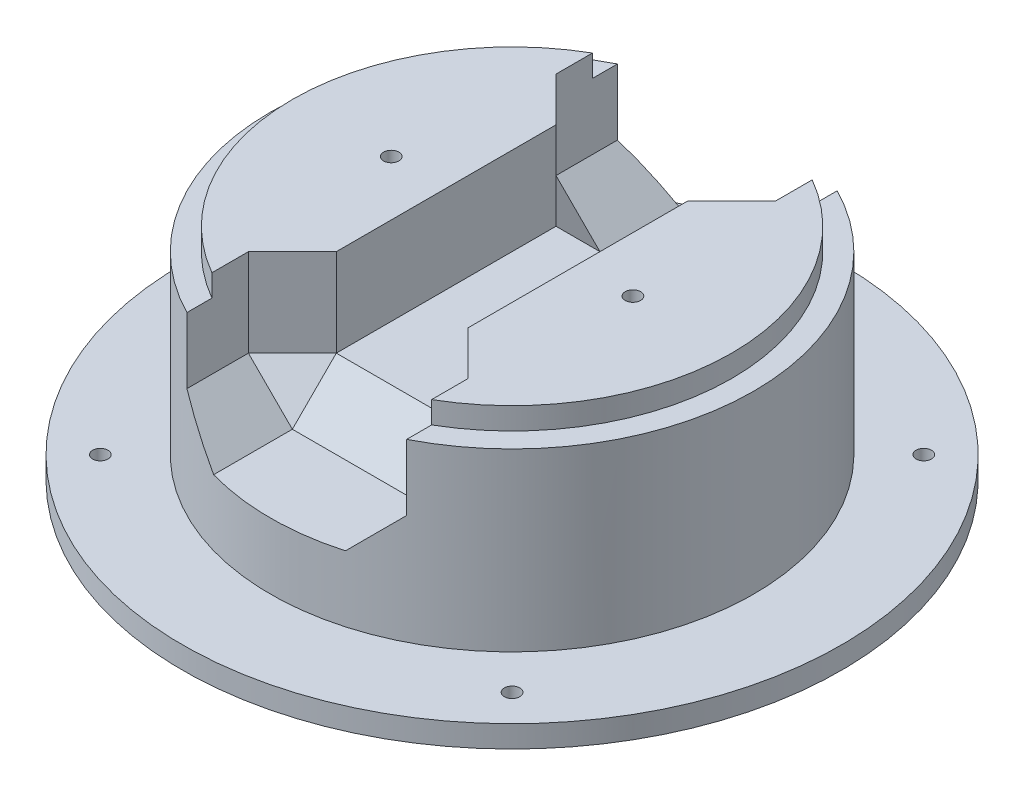
ISO-10303-21;
HEADER;
FILE_DESCRIPTION(('STEP AP214'),'2;1');
FILE_NAME('part.step','',(''),(''),'','','');
FILE_SCHEMA(('AUTOMOTIVE_DESIGN { 1 0 10303 214 1 1 1 1 }'));
ENDSEC;
DATA;
#1=APPLICATION_CONTEXT('core data for automotive mechanical design processes');
#2=APPLICATION_PROTOCOL_DEFINITION('international standard','automotive_design',2000,#1);
#3=PRODUCT_CONTEXT('',#1,'mechanical');
#4=PRODUCT('Part','Part','',(#3));
#5=PRODUCT_RELATED_PRODUCT_CATEGORY('part','',(#4));
#6=PRODUCT_DEFINITION_FORMATION('','',#4);
#7=PRODUCT_DEFINITION_CONTEXT('part definition',#1,'design');
#8=PRODUCT_DEFINITION('design','',#6,#7);
#9=PRODUCT_DEFINITION_SHAPE('','',#8);
#10=(LENGTH_UNIT() NAMED_UNIT(*) SI_UNIT(.MILLI.,.METRE.));
#11=(NAMED_UNIT(*) PLANE_ANGLE_UNIT() SI_UNIT($,.RADIAN.));
#12=(NAMED_UNIT(*) SI_UNIT($,.STERADIAN.) SOLID_ANGLE_UNIT());
#13=UNCERTAINTY_MEASURE_WITH_UNIT(LENGTH_MEASURE(1.E-05),#10,'distance_accuracy_value','');
#14=(GEOMETRIC_REPRESENTATION_CONTEXT(3) GLOBAL_UNCERTAINTY_ASSIGNED_CONTEXT((#13)) GLOBAL_UNIT_ASSIGNED_CONTEXT((#10,
#11,#12)) REPRESENTATION_CONTEXT('',''));
#15=CARTESIAN_POINT('',(0.,0.,0.));
#16=DIRECTION('',(0.,0.,1.));
#17=DIRECTION('',(1.,0.,0.));
#18=AXIS2_PLACEMENT_3D('',#15,#16,#17);
#19=CARTESIAN_POINT('',(0.,45.,0.));
#20=DIRECTION('',(0.,1.,0.));
#21=DIRECTION('',(0.,0.,1.));
#22=AXIS2_PLACEMENT_3D('',#19,#20,#21);
#23=PLANE('',#22);
#24=DIRECTION('',(0.,0.,1.));
#25=VECTOR('',#24,1.);
#26=CARTESIAN_POINT('',(-15.,45.,-25.));
#27=LINE('',#26,#25);
#28=CARTESIAN_POINT('',(-15.,45.,-25.));
#29=VERTEX_POINT('',#28);
#30=CARTESIAN_POINT('',(-15.,45.,25.));
#31=VERTEX_POINT('',#30);
#32=EDGE_CURVE('E229',#29,#31,#27,.T.);
#33=ORIENTED_EDGE('',*,*,#32,.F.);
#34=DIRECTION('',(0.707106781186544,0.,0.707106781186551));
#35=VECTOR('',#34,1.);
#36=CARTESIAN_POINT('',(-15.,45.,-25.));
#37=LINE('',#36,#35);
#38=CARTESIAN_POINT('',(-25.,45.,-35.0000000000001));
#39=VERTEX_POINT('',#38);
#40=EDGE_CURVE('E381',#29,#39,#37,.F.);
#41=ORIENTED_EDGE('',*,*,#40,.T.);
#42=DIRECTION('',(0.,0.,1.));
#43=VECTOR('',#42,1.);
#44=CARTESIAN_POINT('',(-25.,45.,0.));
#45=LINE('',#44,#43);
#46=CARTESIAN_POINT('',(-25.,45.,-43.3012701892219));
#47=VERTEX_POINT('',#46);
#48=EDGE_CURVE('E331',#47,#39,#45,.T.);
#49=ORIENTED_EDGE('',*,*,#48,.F.);
#50=CARTESIAN_POINT('',(0.,45.,0.));
#51=DIRECTION('',(0.,1.,0.));
#52=DIRECTION('',(0.,0.,1.));
#53=AXIS2_PLACEMENT_3D('',#50,#51,#52);
#54=CIRCLE('',#53,50.);
#55=CARTESIAN_POINT('',(-25.,45.,43.3012701892219));
#56=VERTEX_POINT('',#55);
#57=EDGE_CURVE('E311',#47,#56,#54,.T.);
#58=ORIENTED_EDGE('',*,*,#57,.T.);
#59=DIRECTION('',(0.,0.,1.));
#60=VECTOR('',#59,1.);
#61=CARTESIAN_POINT('',(-25.,45.,25.));
#62=LINE('',#61,#60);
#63=CARTESIAN_POINT('',(-25.,45.,35.0000000000001));
#64=VERTEX_POINT('',#63);
#65=EDGE_CURVE('E261',#64,#56,#62,.T.);
#66=ORIENTED_EDGE('',*,*,#65,.F.);
#67=DIRECTION('',(-0.707106781186544,0.,0.707106781186551));
#68=VECTOR('',#67,1.);
#69=CARTESIAN_POINT('',(-25.,45.,35.0000000000001));
#70=LINE('',#69,#68);
#71=EDGE_CURVE('E11',#64,#31,#70,.F.);
#72=ORIENTED_EDGE('',*,*,#71,.T.);
#73=EDGE_LOOP('',(#33,#41,#49,#58,#66,#72));
#74=FACE_BOUND('',#73,.T.);
#75=CARTESIAN_POINT('',(-27.5,45.,0.));
#76=DIRECTION('',(0.,1.,0.));
#77=DIRECTION('',(0.,0.,1.));
#78=AXIS2_PLACEMENT_3D('',#75,#76,#77);
#79=CIRCLE('',#78,1.75);
#80=CARTESIAN_POINT('',(-27.5,45.,1.75));
#81=VERTEX_POINT('',#80);
#82=EDGE_CURVE('E298',#81,#81,#79,.T.);
#83=ORIENTED_EDGE('',*,*,#82,.F.);
#84=EDGE_LOOP('',(#83));
#85=FACE_BOUND('',#84,.T.);
#86=ADVANCED_FACE('F33',(#74,#85),#23,.T.);
#87=CARTESIAN_POINT('',(0.,40.,0.));
#88=DIRECTION('',(0.,1.,0.));
#89=DIRECTION('',(0.,0.,1.));
#90=AXIS2_PLACEMENT_3D('',#87,#88,#89);
#91=PLANE('',#90);
#92=DIRECTION('',(0.,0.,-1.));
#93=VECTOR('',#92,1.);
#94=CARTESIAN_POINT('',(25.,40.,0.));
#95=LINE('',#94,#93);
#96=CARTESIAN_POINT('',(25.,40.,48.9897948556636));
#97=VERTEX_POINT('',#96);
#98=CARTESIAN_POINT('',(25.,40.,43.3012701892219));
#99=VERTEX_POINT('',#98);
#100=EDGE_CURVE('E275',#97,#99,#95,.T.);
#101=ORIENTED_EDGE('',*,*,#100,.F.);
#102=CARTESIAN_POINT('',(0.,40.,0.));
#103=DIRECTION('',(0.,1.,0.));
#104=DIRECTION('',(0.,0.,1.));
#105=AXIS2_PLACEMENT_3D('',#102,#103,#104);
#106=CIRCLE('',#105,55.);
#107=CARTESIAN_POINT('',(25.,40.,-48.9897948556636));
#108=VERTEX_POINT('',#107);
#109=EDGE_CURVE('E327',#97,#108,#106,.T.);
#110=ORIENTED_EDGE('',*,*,#109,.T.);
#111=DIRECTION('',(0.,0.,-1.));
#112=VECTOR('',#111,1.);
#113=CARTESIAN_POINT('',(25.,40.,0.));
#114=LINE('',#113,#112);
#115=CARTESIAN_POINT('',(25.,40.,-43.3012701892219));
#116=VERTEX_POINT('',#115);
#117=EDGE_CURVE('E293',#116,#108,#114,.T.);
#118=ORIENTED_EDGE('',*,*,#117,.F.);
#119=CARTESIAN_POINT('',(0.,40.,0.));
#120=DIRECTION('',(0.,1.,0.));
#121=DIRECTION('',(0.,0.,1.));
#122=AXIS2_PLACEMENT_3D('',#119,#120,#121);
#123=CIRCLE('',#122,50.);
#124=EDGE_CURVE('E310',#99,#116,#123,.T.);
#125=ORIENTED_EDGE('',*,*,#124,.F.);
#126=EDGE_LOOP('',(#101,#110,#118,#125));
#127=FACE_BOUND('',#126,.T.);
#128=ADVANCED_FACE('F429',(#127),#91,.T.);
#129=CARTESIAN_POINT('',(0.,45.,0.));
#130=DIRECTION('',(0.,-1.,0.));
#131=DIRECTION('',(0.,0.,-1.));
#132=AXIS2_PLACEMENT_3D('',#129,#130,#131);
#133=CYLINDRICAL_SURFACE('',#132,50.);
#134=CARTESIAN_POINT('',(25.,45.,43.3012701892219));
#135=VERTEX_POINT('',#134);
#136=CARTESIAN_POINT('',(25.,45.,-43.301270189222));
#137=VERTEX_POINT('',#136);
#138=EDGE_CURVE('E315',#135,#137,#54,.T.);
#139=ORIENTED_EDGE('',*,*,#138,.F.);
#140=DIRECTION('',(0.,-1.,0.));
#141=VECTOR('',#140,1.);
#142=CARTESIAN_POINT('',(25.,45.,43.3012701892219));
#143=LINE('',#142,#141);
#144=EDGE_CURVE('E272',#135,#99,#143,.T.);
#145=ORIENTED_EDGE('',*,*,#144,.T.);
#146=ORIENTED_EDGE('',*,*,#124,.T.);
#147=DIRECTION('',(0.,-1.,0.));
#148=VECTOR('',#147,1.);
#149=CARTESIAN_POINT('',(25.,45.,-43.3012701892219));
#150=LINE('',#149,#148);
#151=EDGE_CURVE('E290',#116,#137,#150,.F.);
#152=ORIENTED_EDGE('',*,*,#151,.T.);
#153=EDGE_LOOP('',(#139,#145,#146,#152));
#154=FACE_BOUND('',#153,.T.);
#155=ADVANCED_FACE('F458',(#154),#133,.T.);
#156=DIRECTION('',(0.,0.,1.));
#157=VECTOR('',#156,1.);
#158=CARTESIAN_POINT('',(-25.,40.,0.));
#159=LINE('',#158,#157);
#160=CARTESIAN_POINT('',(-25.,40.,43.3012701892219));
#161=VERTEX_POINT('',#160);
#162=CARTESIAN_POINT('',(-25.,40.,48.9897948556636));
#163=VERTEX_POINT('',#162);
#164=EDGE_CURVE('E267',#161,#163,#159,.T.);
#165=ORIENTED_EDGE('',*,*,#164,.F.);
#166=CARTESIAN_POINT('',(-25.,40.,-43.3012701892219));
#167=VERTEX_POINT('',#166);
#168=EDGE_CURVE('E316',#167,#161,#123,.T.);
#169=ORIENTED_EDGE('',*,*,#168,.F.);
#170=DIRECTION('',(0.,0.,1.));
#171=VECTOR('',#170,1.);
#172=CARTESIAN_POINT('',(-25.,40.,0.));
#173=LINE('',#172,#171);
#174=CARTESIAN_POINT('',(-25.,40.,-48.9897948556636));
#175=VERTEX_POINT('',#174);
#176=EDGE_CURVE('E285',#175,#167,#173,.T.);
#177=ORIENTED_EDGE('',*,*,#176,.F.);
#178=EDGE_CURVE('E328',#175,#163,#106,.T.);
#179=ORIENTED_EDGE('',*,*,#178,.T.);
#180=EDGE_LOOP('',(#165,#169,#177,#179));
#181=FACE_BOUND('',#180,.T.);
#182=ADVANCED_FACE('F460',(#181),#91,.T.);
#183=CARTESIAN_POINT('',(0.,40.,0.));
#184=DIRECTION('',(0.,-1.,0.));
#185=DIRECTION('',(0.,0.,-1.));
#186=AXIS2_PLACEMENT_3D('',#183,#184,#185);
#187=CYLINDRICAL_SURFACE('',#186,55.);
#188=ORIENTED_EDGE('',*,*,#109,.F.);
#189=DIRECTION('',(0.,-1.,0.));
#190=VECTOR('',#189,1.);
#191=CARTESIAN_POINT('',(25.,40.,48.9897948556636));
#192=LINE('',#191,#190);
#193=CARTESIAN_POINT('',(25.,25.,48.9897948556636));
#194=VERTEX_POINT('',#193);
#195=EDGE_CURVE('E277',#97,#194,#192,.T.);
#196=ORIENTED_EDGE('',*,*,#195,.T.);
#197=CARTESIAN_POINT('',(0.,1.73472347597681E-13,0.));
#198=DIRECTION('',(0.707106781186545,-0.70710678118655,0.));
#199=DIRECTION('',(-0.70710678118655,-0.707106781186545,0.));
#200=AXIS2_PLACEMENT_3D('',#197,#198,#199);
#201=ELLIPSE('',#200,77.7817459305199,55.);
#202=CARTESIAN_POINT('',(14.9999999999999,15.,52.9150262212918));
#203=VERTEX_POINT('',#202);
#204=EDGE_CURVE('E385',#194,#203,#201,.T.);
#205=ORIENTED_EDGE('',*,*,#204,.T.);
#206=CARTESIAN_POINT('',(0.,15.,0.));
#207=DIRECTION('',(0.,1.,0.));
#208=DIRECTION('',(0.,0.,1.));
#209=AXIS2_PLACEMENT_3D('',#206,#207,#208);
#210=CIRCLE('',#209,55.);
#211=CARTESIAN_POINT('',(-14.9999999999999,15.,52.9150262212918));
#212=VERTEX_POINT('',#211);
#213=EDGE_CURVE('E339',#212,#203,#210,.T.);
#214=ORIENTED_EDGE('',*,*,#213,.F.);
#215=CARTESIAN_POINT('',(0.,1.73472347597681E-13,0.));
#216=DIRECTION('',(-0.707106781186545,-0.70710678118655,0.));
#217=DIRECTION('',(0.70710678118655,-0.707106781186545,0.));
#218=AXIS2_PLACEMENT_3D('',#215,#216,#217);
#219=ELLIPSE('',#218,77.7817459305199,55.);
#220=CARTESIAN_POINT('',(-25.,25.,48.9897948556636));
#221=VERTEX_POINT('',#220);
#222=EDGE_CURVE('E383',#212,#221,#219,.T.);
#223=ORIENTED_EDGE('',*,*,#222,.T.);
#224=DIRECTION('',(0.,-1.,0.));
#225=VECTOR('',#224,1.);
#226=CARTESIAN_POINT('',(-25.,40.,48.9897948556636));
#227=LINE('',#226,#225);
#228=EDGE_CURVE('E270',#221,#163,#227,.F.);
#229=ORIENTED_EDGE('',*,*,#228,.T.);
#230=ORIENTED_EDGE('',*,*,#178,.F.);
#231=DIRECTION('',(0.,-1.,0.));
#232=VECTOR('',#231,1.);
#233=CARTESIAN_POINT('',(-25.,40.,-48.9897948556636));
#234=LINE('',#233,#232);
#235=CARTESIAN_POINT('',(-25.,25.,-48.9897948556636));
#236=VERTEX_POINT('',#235);
#237=EDGE_CURVE('E287',#175,#236,#234,.T.);
#238=ORIENTED_EDGE('',*,*,#237,.T.);
#239=CARTESIAN_POINT('',(0.,1.73472347597681E-13,0.));
#240=DIRECTION('',(-0.707106781186545,-0.70710678118655,0.));
#241=DIRECTION('',(0.70710678118655,-0.707106781186545,0.));
#242=AXIS2_PLACEMENT_3D('',#239,#240,#241);
#243=ELLIPSE('',#242,77.7817459305199,55.);
#244=CARTESIAN_POINT('',(-14.9999999999999,15.,-52.9150262212918));
#245=VERTEX_POINT('',#244);
#246=EDGE_CURVE('E205',#236,#245,#243,.T.);
#247=ORIENTED_EDGE('',*,*,#246,.T.);
#248=CARTESIAN_POINT('',(0.,15.,0.));
#249=DIRECTION('',(0.,1.,0.));
#250=DIRECTION('',(0.,0.,1.));
#251=AXIS2_PLACEMENT_3D('',#248,#249,#250);
#252=CIRCLE('',#251,55.);
#253=CARTESIAN_POINT('',(14.9999999999999,15.,-52.9150262212918));
#254=VERTEX_POINT('',#253);
#255=EDGE_CURVE('E334',#254,#245,#252,.T.);
#256=ORIENTED_EDGE('',*,*,#255,.F.);
#257=CARTESIAN_POINT('',(0.,1.73472347597681E-13,0.));
#258=DIRECTION('',(0.707106781186545,-0.70710678118655,0.));
#259=DIRECTION('',(-0.70710678118655,-0.707106781186545,0.));
#260=AXIS2_PLACEMENT_3D('',#257,#258,#259);
#261=ELLIPSE('',#260,77.7817459305199,55.);
#262=CARTESIAN_POINT('',(25.,25.,-48.9897948556636));
#263=VERTEX_POINT('',#262);
#264=EDGE_CURVE('E376',#254,#263,#261,.T.);
#265=ORIENTED_EDGE('',*,*,#264,.T.);
#266=DIRECTION('',(0.,-1.,0.));
#267=VECTOR('',#266,1.);
#268=CARTESIAN_POINT('',(25.,40.,-48.9897948556636));
#269=LINE('',#268,#267);
#270=EDGE_CURVE('E296',#263,#108,#269,.F.);
#271=ORIENTED_EDGE('',*,*,#270,.T.);
#272=EDGE_LOOP('',(#188,#196,#205,#214,#223,#229,#230,#238,#247,#256,#265,#271));
#273=FACE_BOUND('',#272,.T.);
#274=CARTESIAN_POINT('',(0.,0.,0.));
#275=DIRECTION('',(0.,-1.,0.));
#276=DIRECTION('',(0.,0.,-1.));
#277=AXIS2_PLACEMENT_3D('',#274,#275,#276);
#278=CIRCLE('',#277,55.);
#279=CARTESIAN_POINT('',(0.,0.,-55.));
#280=VERTEX_POINT('',#279);
#281=EDGE_CURVE('E322',#280,#280,#278,.T.);
#282=ORIENTED_EDGE('',*,*,#281,.F.);
#283=EDGE_LOOP('',(#282));
#284=FACE_BOUND('',#283,.T.);
#285=ADVANCED_FACE('F418',(#273,#284),#187,.T.);
#286=CARTESIAN_POINT('',(0.,0.,0.));
#287=DIRECTION('',(0.,-1.,0.));
#288=DIRECTION('',(0.,0.,-1.));
#289=AXIS2_PLACEMENT_3D('',#286,#287,#288);
#290=PLANE('',#289);
#291=CARTESIAN_POINT('',(46.8458242536088,0.,46.8458242536088));
#292=DIRECTION('',(0.,1.,0.));
#293=DIRECTION('',(0.,0.,1.));
#294=AXIS2_PLACEMENT_3D('',#291,#292,#293);
#295=CIRCLE('',#294,1.74999999999999);
#296=CARTESIAN_POINT('',(46.8458242536088,0.,48.5958242536088));
#297=VERTEX_POINT('',#296);
#298=EDGE_CURVE('E237',#297,#297,#295,.T.);
#299=ORIENTED_EDGE('',*,*,#298,.F.);
#300=EDGE_LOOP('',(#299));
#301=FACE_BOUND('',#300,.T.);
#302=CARTESIAN_POINT('',(-46.8458242536088,0.,-46.8458242536088));
#303=DIRECTION('',(0.,1.,0.));
#304=DIRECTION('',(0.,0.,1.));
#305=AXIS2_PLACEMENT_3D('',#302,#303,#304);
#306=CIRCLE('',#305,1.74999999999999);
#307=CARTESIAN_POINT('',(-46.8458242536088,0.,-45.0958242536088));
#308=VERTEX_POINT('',#307);
#309=EDGE_CURVE('E236',#308,#308,#306,.T.);
#310=ORIENTED_EDGE('',*,*,#309,.F.);
#311=EDGE_LOOP('',(#310));
#312=FACE_BOUND('',#311,.T.);
#313=CARTESIAN_POINT('',(-46.8458242536088,0.,46.8458242536088));
#314=DIRECTION('',(0.,1.,0.));
#315=DIRECTION('',(0.,0.,1.));
#316=AXIS2_PLACEMENT_3D('',#313,#314,#315);
#317=CIRCLE('',#316,1.74999999999999);
#318=CARTESIAN_POINT('',(-46.8458242536088,0.,48.5958242536088));
#319=VERTEX_POINT('',#318);
#320=EDGE_CURVE('E233',#319,#319,#317,.T.);
#321=ORIENTED_EDGE('',*,*,#320,.F.);
#322=EDGE_LOOP('',(#321));
#323=FACE_BOUND('',#322,.T.);
#324=CARTESIAN_POINT('',(46.8458242536088,0.,-46.8458242536088));
#325=DIRECTION('',(0.,1.,0.));
#326=DIRECTION('',(0.,0.,1.));
#327=AXIS2_PLACEMENT_3D('',#324,#325,#326);
#328=CIRCLE('',#327,1.74999999999999);
#329=CARTESIAN_POINT('',(46.8458242536088,0.,-45.0958242536088));
#330=VERTEX_POINT('',#329);
#331=EDGE_CURVE('E230',#330,#330,#328,.T.);
#332=ORIENTED_EDGE('',*,*,#331,.F.);
#333=EDGE_LOOP('',(#332));
#334=FACE_BOUND('',#333,.T.);
#335=CARTESIAN_POINT('',(0.,0.,0.));
#336=DIRECTION('',(0.,-1.,0.));
#337=DIRECTION('',(0.,0.,-1.));
#338=AXIS2_PLACEMENT_3D('',#335,#336,#337);
#339=CIRCLE('',#338,75.);
#340=CARTESIAN_POINT('',(0.,0.,-75.));
#341=VERTEX_POINT('',#340);
#342=EDGE_CURVE('E314',#341,#341,#339,.T.);
#343=ORIENTED_EDGE('',*,*,#342,.F.);
#344=EDGE_LOOP('',(#343));
#345=FACE_BOUND('',#344,.T.);
#346=ORIENTED_EDGE('',*,*,#281,.T.);
#347=EDGE_LOOP('',(#346));
#348=FACE_BOUND('',#347,.T.);
#349=ADVANCED_FACE('F574',(#301,#312,#323,#334,#345,#348),#290,.F.);
#350=CARTESIAN_POINT('',(0.,-5.,0.));
#351=DIRECTION('',(0.,1.,0.));
#352=DIRECTION('',(0.,0.,1.));
#353=AXIS2_PLACEMENT_3D('',#350,#351,#352);
#354=CYLINDRICAL_SURFACE('',#353,75.);
#355=CARTESIAN_POINT('',(0.,-5.,0.));
#356=DIRECTION('',(0.,-1.,0.));
#357=DIRECTION('',(0.,0.,-1.));
#358=AXIS2_PLACEMENT_3D('',#355,#356,#357);
#359=CIRCLE('',#358,75.);
#360=CARTESIAN_POINT('',(0.,-5.,-75.));
#361=VERTEX_POINT('',#360);
#362=EDGE_CURVE('E319',#361,#361,#359,.T.);
#363=ORIENTED_EDGE('',*,*,#362,.F.);
#364=EDGE_LOOP('',(#363));
#365=FACE_BOUND('',#364,.T.);
#366=ORIENTED_EDGE('',*,*,#342,.T.);
#367=EDGE_LOOP('',(#366));
#368=FACE_BOUND('',#367,.T.);
#369=ADVANCED_FACE('F562',(#365,#368),#354,.T.);
#370=CARTESIAN_POINT('',(0.,-5.,0.));
#371=DIRECTION('',(0.,-1.,0.));
#372=DIRECTION('',(0.,0.,-1.));
#373=AXIS2_PLACEMENT_3D('',#370,#371,#372);
#374=PLANE('',#373);
#375=CARTESIAN_POINT('',(0.,-5.,0.));
#376=DIRECTION('',(0.,-1.,0.));
#377=DIRECTION('',(0.,0.,-1.));
#378=AXIS2_PLACEMENT_3D('',#375,#376,#377);
#379=CIRCLE('',#378,1.74999999999999);
#380=CARTESIAN_POINT('',(0.,-5.,-1.74999999999999));
#381=VERTEX_POINT('',#380);
#382=EDGE_CURVE('E37',#381,#381,#379,.T.);
#383=ORIENTED_EDGE('',*,*,#382,.F.);
#384=EDGE_LOOP('',(#383));
#385=FACE_BOUND('',#384,.T.);
#386=CARTESIAN_POINT('',(46.8458242536088,-5.,46.8458242536088));
#387=DIRECTION('',(0.,-1.,0.));
#388=DIRECTION('',(0.,0.,-1.));
#389=AXIS2_PLACEMENT_3D('',#386,#387,#388);
#390=CIRCLE('',#389,1.74999999999999);
#391=CARTESIAN_POINT('',(46.8458242536088,-5.,45.0958242536088));
#392=VERTEX_POINT('',#391);
#393=EDGE_CURVE('E234',#392,#392,#390,.T.);
#394=ORIENTED_EDGE('',*,*,#393,.F.);
#395=EDGE_LOOP('',(#394));
#396=FACE_BOUND('',#395,.T.);
#397=CARTESIAN_POINT('',(-46.8458242536088,-5.,-46.8458242536088));
#398=DIRECTION('',(0.,-1.,0.));
#399=DIRECTION('',(0.,0.,-1.));
#400=AXIS2_PLACEMENT_3D('',#397,#398,#399);
#401=CIRCLE('',#400,1.74999999999999);
#402=CARTESIAN_POINT('',(-46.8458242536088,-5.,-48.5958242536088));
#403=VERTEX_POINT('',#402);
#404=EDGE_CURVE('E241',#403,#403,#401,.T.);
#405=ORIENTED_EDGE('',*,*,#404,.F.);
#406=EDGE_LOOP('',(#405));
#407=FACE_BOUND('',#406,.T.);
#408=CARTESIAN_POINT('',(-46.8458242536088,-5.,46.8458242536088));
#409=DIRECTION('',(0.,-1.,0.));
#410=DIRECTION('',(0.,0.,-1.));
#411=AXIS2_PLACEMENT_3D('',#408,#409,#410);
#412=CIRCLE('',#411,1.74999999999999);
#413=CARTESIAN_POINT('',(-46.8458242536088,-5.,45.0958242536088));
#414=VERTEX_POINT('',#413);
#415=EDGE_CURVE('E231',#414,#414,#412,.T.);
#416=ORIENTED_EDGE('',*,*,#415,.F.);
#417=EDGE_LOOP('',(#416));
#418=FACE_BOUND('',#417,.T.);
#419=CARTESIAN_POINT('',(46.8458242536088,-5.,-46.8458242536088));
#420=DIRECTION('',(0.,-1.,0.));
#421=DIRECTION('',(0.,0.,-1.));
#422=AXIS2_PLACEMENT_3D('',#419,#420,#421);
#423=CIRCLE('',#422,1.74999999999999);
#424=CARTESIAN_POINT('',(46.8458242536088,-5.,-48.5958242536088));
#425=VERTEX_POINT('',#424);
#426=EDGE_CURVE('E226',#425,#425,#423,.T.);
#427=ORIENTED_EDGE('',*,*,#426,.F.);
#428=EDGE_LOOP('',(#427));
#429=FACE_BOUND('',#428,.T.);
#430=ORIENTED_EDGE('',*,*,#362,.T.);
#431=EDGE_LOOP('',(#430));
#432=FACE_BOUND('',#431,.T.);
#433=ADVANCED_FACE('F472',(#385,#396,#407,#418,#429,#432),#374,.T.);
#434=ORIENTED_EDGE('',*,*,#168,.T.);
#435=DIRECTION('',(0.,-1.,0.));
#436=VECTOR('',#435,1.);
#437=CARTESIAN_POINT('',(-25.,45.,43.3012701892219));
#438=LINE('',#437,#436);
#439=EDGE_CURVE('E263',#161,#56,#438,.F.);
#440=ORIENTED_EDGE('',*,*,#439,.T.);
#441=ORIENTED_EDGE('',*,*,#57,.F.);
#442=DIRECTION('',(0.,-1.,0.));
#443=VECTOR('',#442,1.);
#444=CARTESIAN_POINT('',(-25.,45.,-43.3012701892219));
#445=LINE('',#444,#443);
#446=EDGE_CURVE('E282',#47,#167,#445,.T.);
#447=ORIENTED_EDGE('',*,*,#446,.T.);
#448=EDGE_LOOP('',(#434,#440,#441,#447));
#449=FACE_BOUND('',#448,.T.);
#450=ADVANCED_FACE('F462',(#449),#133,.T.);
#451=DIRECTION('',(0.,0.,-1.));
#452=VECTOR('',#451,1.);
#453=CARTESIAN_POINT('',(15.,45.,-25.));
#454=LINE('',#453,#452);
#455=CARTESIAN_POINT('',(15.,45.,25.));
#456=VERTEX_POINT('',#455);
#457=CARTESIAN_POINT('',(15.,45.,-25.));
#458=VERTEX_POINT('',#457);
#459=EDGE_CURVE('E257',#456,#458,#454,.T.);
#460=ORIENTED_EDGE('',*,*,#459,.F.);
#461=DIRECTION('',(-0.707106781186544,0.,-0.707106781186551));
#462=VECTOR('',#461,1.);
#463=CARTESIAN_POINT('',(15.,45.,25.));
#464=LINE('',#463,#462);
#465=CARTESIAN_POINT('',(25.,45.,35.0000000000001));
#466=VERTEX_POINT('',#465);
#467=EDGE_CURVE('E42',#456,#466,#464,.F.);
#468=ORIENTED_EDGE('',*,*,#467,.T.);
#469=DIRECTION('',(0.,0.,-1.));
#470=VECTOR('',#469,1.);
#471=CARTESIAN_POINT('',(25.,45.,0.));
#472=LINE('',#471,#470);
#473=EDGE_CURVE('E337',#135,#466,#472,.T.);
#474=ORIENTED_EDGE('',*,*,#473,.F.);
#475=ORIENTED_EDGE('',*,*,#138,.T.);
#476=DIRECTION('',(0.,0.,-1.));
#477=VECTOR('',#476,1.);
#478=CARTESIAN_POINT('',(25.,45.,-85.));
#479=LINE('',#478,#477);
#480=CARTESIAN_POINT('',(25.,45.,-35.0000000000001));
#481=VERTEX_POINT('',#480);
#482=EDGE_CURVE('E280',#481,#137,#479,.T.);
#483=ORIENTED_EDGE('',*,*,#482,.F.);
#484=DIRECTION('',(0.707106781186544,0.,-0.707106781186551));
#485=VECTOR('',#484,1.);
#486=CARTESIAN_POINT('',(25.,45.,-35.0000000000001));
#487=LINE('',#486,#485);
#488=EDGE_CURVE('E378',#481,#458,#487,.F.);
#489=ORIENTED_EDGE('',*,*,#488,.T.);
#490=EDGE_LOOP('',(#460,#468,#474,#475,#483,#489));
#491=FACE_BOUND('',#490,.T.);
#492=CARTESIAN_POINT('',(27.5,45.,0.));
#493=DIRECTION('',(0.,1.,0.));
#494=DIRECTION('',(0.,0.,1.));
#495=AXIS2_PLACEMENT_3D('',#492,#493,#494);
#496=CIRCLE('',#495,1.75);
#497=CARTESIAN_POINT('',(27.5,45.,1.74999999999999));
#498=VERTEX_POINT('',#497);
#499=EDGE_CURVE('E304',#498,#498,#496,.T.);
#500=ORIENTED_EDGE('',*,*,#499,.F.);
#501=EDGE_LOOP('',(#500));
#502=FACE_BOUND('',#501,.T.);
#503=ADVANCED_FACE('F453',(#491,#502),#23,.T.);
#504=CARTESIAN_POINT('',(27.5,35.,0.));
#505=DIRECTION('',(0.,1.,0.));
#506=DIRECTION('',(0.,0.,1.));
#507=AXIS2_PLACEMENT_3D('',#504,#505,#506);
#508=CONICAL_SURFACE('',#507,1.75,1.02974425867665);
#509=CARTESIAN_POINT('',(27.5,33.9484939167018,0.));
#510=VERTEX_POINT('',#509);
#511=VERTEX_LOOP('',#510);
#512=FACE_BOUND('',#511,.T.);
#513=CARTESIAN_POINT('',(27.5,35.,0.));
#514=DIRECTION('',(0.,1.,0.));
#515=DIRECTION('',(0.,0.,1.));
#516=AXIS2_PLACEMENT_3D('',#513,#514,#515);
#517=CIRCLE('',#516,1.75);
#518=CARTESIAN_POINT('',(27.5,35.,1.74999999999999));
#519=VERTEX_POINT('',#518);
#520=EDGE_CURVE('E307',#519,#519,#517,.T.);
#521=ORIENTED_EDGE('',*,*,#520,.T.);
#522=EDGE_LOOP('',(#521));
#523=FACE_BOUND('',#522,.T.);
#524=ADVANCED_FACE('F483',(#512,#523),#508,.F.);
#525=CARTESIAN_POINT('',(27.5,45.,0.));
#526=DIRECTION('',(0.,1.,0.));
#527=DIRECTION('',(0.,0.,1.));
#528=AXIS2_PLACEMENT_3D('',#525,#526,#527);
#529=CYLINDRICAL_SURFACE('',#528,1.75);
#530=ORIENTED_EDGE('',*,*,#520,.F.);
#531=EDGE_LOOP('',(#530));
#532=FACE_BOUND('',#531,.T.);
#533=ORIENTED_EDGE('',*,*,#499,.T.);
#534=EDGE_LOOP('',(#533));
#535=FACE_BOUND('',#534,.T.);
#536=ADVANCED_FACE('F488',(#532,#535),#529,.F.);
#537=CARTESIAN_POINT('',(-27.5,35.,0.));
#538=DIRECTION('',(0.,1.,0.));
#539=DIRECTION('',(0.,0.,1.));
#540=AXIS2_PLACEMENT_3D('',#537,#538,#539);
#541=CONICAL_SURFACE('',#540,1.75,1.02974425867665);
#542=CARTESIAN_POINT('',(-27.5,33.9484939167018,0.));
#543=VERTEX_POINT('',#542);
#544=VERTEX_LOOP('',#543);
#545=FACE_BOUND('',#544,.T.);
#546=CARTESIAN_POINT('',(-27.5,35.,0.));
#547=DIRECTION('',(0.,1.,0.));
#548=DIRECTION('',(0.,0.,1.));
#549=AXIS2_PLACEMENT_3D('',#546,#547,#548);
#550=CIRCLE('',#549,1.75);
#551=CARTESIAN_POINT('',(-27.5,35.,1.75));
#552=VERTEX_POINT('',#551);
#553=EDGE_CURVE('E301',#552,#552,#550,.T.);
#554=ORIENTED_EDGE('',*,*,#553,.T.);
#555=EDGE_LOOP('',(#554));
#556=FACE_BOUND('',#555,.T.);
#557=ADVANCED_FACE('F493',(#545,#556),#541,.F.);
#558=CARTESIAN_POINT('',(-27.5,45.,0.));
#559=DIRECTION('',(0.,1.,0.));
#560=DIRECTION('',(0.,0.,1.));
#561=AXIS2_PLACEMENT_3D('',#558,#559,#560);
#562=CYLINDRICAL_SURFACE('',#561,1.75);
#563=ORIENTED_EDGE('',*,*,#553,.F.);
#564=EDGE_LOOP('',(#563));
#565=FACE_BOUND('',#564,.T.);
#566=ORIENTED_EDGE('',*,*,#82,.T.);
#567=EDGE_LOOP('',(#566));
#568=FACE_BOUND('',#567,.T.);
#569=ADVANCED_FACE('F500',(#565,#568),#562,.F.);
#570=CARTESIAN_POINT('',(0.,15.,0.));
#571=DIRECTION('',(0.,1.,0.));
#572=DIRECTION('',(0.,0.,1.));
#573=AXIS2_PLACEMENT_3D('',#570,#571,#572);
#574=PLANE('',#573);
#575=ORIENTED_EDGE('',*,*,#255,.T.);
#576=DIRECTION('',(0.,0.,1.));
#577=VECTOR('',#576,1.);
#578=CARTESIAN_POINT('',(-14.9999999999999,15.,0.));
#579=LINE('',#578,#577);
#580=CARTESIAN_POINT('',(-14.9999999999999,15.,-35.0000000000001));
#581=VERTEX_POINT('',#580);
#582=EDGE_CURVE('E346',#245,#581,#579,.T.);
#583=ORIENTED_EDGE('',*,*,#582,.T.);
#584=DIRECTION('',(1.,0.,0.));
#585=VECTOR('',#584,1.);
#586=CARTESIAN_POINT('',(0.,15.,-35.0000000000001));
#587=LINE('',#586,#585);
#588=CARTESIAN_POINT('',(14.9999999999999,15.,-35.0000000000001));
#589=VERTEX_POINT('',#588);
#590=EDGE_CURVE('E342',#581,#589,#587,.T.);
#591=ORIENTED_EDGE('',*,*,#590,.T.);
#592=DIRECTION('',(0.,0.,-1.));
#593=VECTOR('',#592,1.);
#594=CARTESIAN_POINT('',(14.9999999999999,15.,0.));
#595=LINE('',#594,#593);
#596=EDGE_CURVE('E344',#589,#254,#595,.T.);
#597=ORIENTED_EDGE('',*,*,#596,.T.);
#598=EDGE_LOOP('',(#575,#583,#591,#597));
#599=FACE_BOUND('',#598,.T.);
#600=ADVANCED_FACE('F504',(#599),#574,.T.);
#601=CARTESIAN_POINT('',(25.,15.,-85.));
#602=DIRECTION('',(1.,0.,0.));
#603=DIRECTION('',(0.,0.,-1.));
#604=AXIS2_PLACEMENT_3D('',#601,#602,#603);
#605=PLANE('',#604);
#606=ORIENTED_EDGE('',*,*,#270,.F.);
#607=DIRECTION('',(0.,0.,1.));
#608=VECTOR('',#607,1.);
#609=CARTESIAN_POINT('',(25.,25.,-85.));
#610=LINE('',#609,#608);
#611=CARTESIAN_POINT('',(25.,25.,-35.0000000000001));
#612=VERTEX_POINT('',#611);
#613=EDGE_CURVE('E355',#263,#612,#610,.T.);
#614=ORIENTED_EDGE('',*,*,#613,.T.);
#615=DIRECTION('',(0.,1.,0.));
#616=VECTOR('',#615,1.);
#617=CARTESIAN_POINT('',(25.,45.,-35.0000000000001));
#618=LINE('',#617,#616);
#619=EDGE_CURVE('E353',#612,#481,#618,.T.);
#620=ORIENTED_EDGE('',*,*,#619,.T.);
#621=ORIENTED_EDGE('',*,*,#482,.T.);
#622=ORIENTED_EDGE('',*,*,#151,.F.);
#623=ORIENTED_EDGE('',*,*,#117,.T.);
#624=EDGE_LOOP('',(#606,#614,#620,#621,#622,#623));
#625=FACE_BOUND('',#624,.T.);
#626=ADVANCED_FACE('F436',(#625),#605,.F.);
#627=CARTESIAN_POINT('',(-25.,15.,-85.));
#628=DIRECTION('',(-1.,0.,0.));
#629=DIRECTION('',(0.,0.,1.));
#630=AXIS2_PLACEMENT_3D('',#627,#628,#629);
#631=PLANE('',#630);
#632=DIRECTION('',(0.,-1.,0.));
#633=VECTOR('',#632,1.);
#634=CARTESIAN_POINT('',(-25.,15.,-35.0000000000001));
#635=LINE('',#634,#633);
#636=CARTESIAN_POINT('',(-25.,25.,-35.0000000000001));
#637=VERTEX_POINT('',#636);
#638=EDGE_CURVE('E349',#39,#637,#635,.T.);
#639=ORIENTED_EDGE('',*,*,#638,.T.);
#640=DIRECTION('',(0.,0.,-1.));
#641=VECTOR('',#640,1.);
#642=CARTESIAN_POINT('',(-25.,25.,-85.));
#643=LINE('',#642,#641);
#644=EDGE_CURVE('E351',#637,#236,#643,.T.);
#645=ORIENTED_EDGE('',*,*,#644,.T.);
#646=ORIENTED_EDGE('',*,*,#237,.F.);
#647=ORIENTED_EDGE('',*,*,#176,.T.);
#648=ORIENTED_EDGE('',*,*,#446,.F.);
#649=ORIENTED_EDGE('',*,*,#48,.T.);
#650=EDGE_LOOP('',(#639,#645,#646,#647,#648,#649));
#651=FACE_BOUND('',#650,.T.);
#652=ADVANCED_FACE('F508',(#651),#631,.F.);
#653=CARTESIAN_POINT('',(0.,15.,0.));
#654=DIRECTION('',(0.,1.,0.));
#655=DIRECTION('',(0.,0.,1.));
#656=AXIS2_PLACEMENT_3D('',#653,#654,#655);
#657=PLANE('',#656);
#658=DIRECTION('',(-1.,0.,0.));
#659=VECTOR('',#658,1.);
#660=CARTESIAN_POINT('',(0.,15.,35.0000000000001));
#661=LINE('',#660,#659);
#662=CARTESIAN_POINT('',(14.9999999999999,15.,35.0000000000001));
#663=VERTEX_POINT('',#662);
#664=CARTESIAN_POINT('',(-14.9999999999999,15.,35.0000000000001));
#665=VERTEX_POINT('',#664);
#666=EDGE_CURVE('E217',#663,#665,#661,.T.);
#667=ORIENTED_EDGE('',*,*,#666,.T.);
#668=DIRECTION('',(0.,0.,1.));
#669=VECTOR('',#668,1.);
#670=CARTESIAN_POINT('',(-14.9999999999999,15.,0.));
#671=LINE('',#670,#669);
#672=EDGE_CURVE('E365',#665,#212,#671,.T.);
#673=ORIENTED_EDGE('',*,*,#672,.T.);
#674=ORIENTED_EDGE('',*,*,#213,.T.);
#675=DIRECTION('',(0.,0.,-1.));
#676=VECTOR('',#675,1.);
#677=CARTESIAN_POINT('',(14.9999999999999,15.,0.));
#678=LINE('',#677,#676);
#679=EDGE_CURVE('E363',#203,#663,#678,.T.);
#680=ORIENTED_EDGE('',*,*,#679,.T.);
#681=EDGE_LOOP('',(#667,#673,#674,#680));
#682=FACE_BOUND('',#681,.T.);
#683=ADVANCED_FACE('F414',(#682),#657,.T.);
#684=CARTESIAN_POINT('',(25.,15.,25.));
#685=DIRECTION('',(1.,0.,0.));
#686=DIRECTION('',(0.,0.,-1.));
#687=AXIS2_PLACEMENT_3D('',#684,#685,#686);
#688=PLANE('',#687);
#689=DIRECTION('',(0.,-1.,0.));
#690=VECTOR('',#689,1.);
#691=CARTESIAN_POINT('',(25.,15.,35.0000000000001));
#692=LINE('',#691,#690);
#693=CARTESIAN_POINT('',(25.,25.,35.0000000000001));
#694=VERTEX_POINT('',#693);
#695=EDGE_CURVE('E58',#466,#694,#692,.T.);
#696=ORIENTED_EDGE('',*,*,#695,.T.);
#697=DIRECTION('',(0.,0.,1.));
#698=VECTOR('',#697,1.);
#699=CARTESIAN_POINT('',(25.,25.,25.));
#700=LINE('',#699,#698);
#701=EDGE_CURVE('E197',#694,#194,#700,.T.);
#702=ORIENTED_EDGE('',*,*,#701,.T.);
#703=ORIENTED_EDGE('',*,*,#195,.F.);
#704=ORIENTED_EDGE('',*,*,#100,.T.);
#705=ORIENTED_EDGE('',*,*,#144,.F.);
#706=ORIENTED_EDGE('',*,*,#473,.T.);
#707=EDGE_LOOP('',(#696,#702,#703,#704,#705,#706));
#708=FACE_BOUND('',#707,.T.);
#709=ADVANCED_FACE('F424',(#708),#688,.F.);
#710=CARTESIAN_POINT('',(-25.,15.,25.));
#711=DIRECTION('',(-1.,0.,0.));
#712=DIRECTION('',(0.,0.,1.));
#713=AXIS2_PLACEMENT_3D('',#710,#711,#712);
#714=PLANE('',#713);
#715=ORIENTED_EDGE('',*,*,#228,.F.);
#716=DIRECTION('',(0.,0.,-1.));
#717=VECTOR('',#716,1.);
#718=CARTESIAN_POINT('',(-25.,25.,25.));
#719=LINE('',#718,#717);
#720=CARTESIAN_POINT('',(-25.,25.,35.0000000000001));
#721=VERTEX_POINT('',#720);
#722=EDGE_CURVE('E370',#221,#721,#719,.T.);
#723=ORIENTED_EDGE('',*,*,#722,.T.);
#724=DIRECTION('',(0.,1.,0.));
#725=VECTOR('',#724,1.);
#726=CARTESIAN_POINT('',(-25.,45.,35.0000000000001));
#727=LINE('',#726,#725);
#728=EDGE_CURVE('E368',#721,#64,#727,.T.);
#729=ORIENTED_EDGE('',*,*,#728,.T.);
#730=ORIENTED_EDGE('',*,*,#65,.T.);
#731=ORIENTED_EDGE('',*,*,#439,.F.);
#732=ORIENTED_EDGE('',*,*,#164,.T.);
#733=EDGE_LOOP('',(#715,#723,#729,#730,#731,#732));
#734=FACE_BOUND('',#733,.T.);
#735=ADVANCED_FACE('F517',(#734),#714,.F.);
#736=CARTESIAN_POINT('',(14.9999999999999,15.,0.));
#737=DIRECTION('',(0.707106781186545,-0.70710678118655,0.));
#738=DIRECTION('',(0.,0.,-1.));
#739=AXIS2_PLACEMENT_3D('',#736,#737,#738);
#740=PLANE('',#739);
#741=ORIENTED_EDGE('',*,*,#264,.F.);
#742=ORIENTED_EDGE('',*,*,#596,.F.);
#743=DIRECTION('',(-0.70710678118655,-0.707106781186545,0.));
#744=VECTOR('',#743,1.);
#745=CARTESIAN_POINT('',(25.,25.,-35.0000000000001));
#746=LINE('',#745,#744);
#747=EDGE_CURVE('E264',#612,#589,#746,.T.);
#748=ORIENTED_EDGE('',*,*,#747,.F.);
#749=ORIENTED_EDGE('',*,*,#613,.F.);
#750=EDGE_LOOP('',(#741,#742,#748,#749));
#751=FACE_BOUND('',#750,.T.);
#752=ADVANCED_FACE('F441',(#751),#740,.F.);
#753=CARTESIAN_POINT('',(25.,15.,-35.0000000000001));
#754=DIRECTION('',(-0.707106781186551,0.,-0.707106781186544));
#755=DIRECTION('',(0.,-1.,0.));
#756=AXIS2_PLACEMENT_3D('',#753,#754,#755);
#757=PLANE('',#756);
#758=ORIENTED_EDGE('',*,*,#488,.F.);
#759=ORIENTED_EDGE('',*,*,#619,.F.);
#760=DIRECTION('',(-0.707106781186544,0.,0.707106781186551));
#761=VECTOR('',#760,1.);
#762=CARTESIAN_POINT('',(25.,25.,-35.0000000000001));
#763=LINE('',#762,#761);
#764=CARTESIAN_POINT('',(15.,25.,-25.));
#765=VERTEX_POINT('',#764);
#766=EDGE_CURVE('E398',#765,#612,#763,.F.);
#767=ORIENTED_EDGE('',*,*,#766,.F.);
#768=DIRECTION('',(0.,-1.,0.));
#769=VECTOR('',#768,1.);
#770=CARTESIAN_POINT('',(15.,15.,-25.));
#771=LINE('',#770,#769);
#772=EDGE_CURVE('E185',#458,#765,#771,.T.);
#773=ORIENTED_EDGE('',*,*,#772,.F.);
#774=EDGE_LOOP('',(#758,#759,#767,#773));
#775=FACE_BOUND('',#774,.T.);
#776=ADVANCED_FACE('F449',(#775),#757,.T.);
#777=CARTESIAN_POINT('',(25.,25.,-35.0000000000001));
#778=DIRECTION('',(-0.577350269189626,0.577350269189631,-0.577350269189621));
#779=DIRECTION('',(-0.70710678118655,-0.707106781186545,0.));
#780=AXIS2_PLACEMENT_3D('',#777,#778,#779);
#781=PLANE('',#780);
#782=ORIENTED_EDGE('',*,*,#766,.T.);
#783=ORIENTED_EDGE('',*,*,#747,.T.);
#784=DIRECTION('',(0.,0.707106781186544,0.70710678118655));
#785=VECTOR('',#784,1.);
#786=CARTESIAN_POINT('',(15.,20.,-30.));
#787=LINE('',#786,#785);
#788=EDGE_CURVE('E395',#765,#589,#787,.F.);
#789=ORIENTED_EDGE('',*,*,#788,.F.);
#790=EDGE_LOOP('',(#782,#783,#789));
#791=FACE_BOUND('',#790,.T.);
#792=ADVANCED_FACE('F445',(#791),#781,.T.);
#793=CARTESIAN_POINT('',(0.,15.,-35.0000000000001));
#794=DIRECTION('',(0.,-0.707106781186551,0.707106781186545));
#795=DIRECTION('',(1.,0.,0.));
#796=AXIS2_PLACEMENT_3D('',#793,#794,#795);
#797=PLANE('',#796);
#798=ORIENTED_EDGE('',*,*,#788,.T.);
#799=ORIENTED_EDGE('',*,*,#590,.F.);
#800=DIRECTION('',(0.,-0.707106781186544,-0.70710678118655));
#801=VECTOR('',#800,1.);
#802=CARTESIAN_POINT('',(-14.9999999999999,15.,-35.0000000000001));
#803=LINE('',#802,#801);
#804=CARTESIAN_POINT('',(-15.,25.,-25.));
#805=VERTEX_POINT('',#804);
#806=EDGE_CURVE('E392',#805,#581,#803,.T.);
#807=ORIENTED_EDGE('',*,*,#806,.F.);
#808=DIRECTION('',(-1.,0.,0.));
#809=VECTOR('',#808,1.);
#810=CARTESIAN_POINT('',(-25.,25.,-25.));
#811=LINE('',#810,#809);
#812=EDGE_CURVE('E357',#765,#805,#811,.T.);
#813=ORIENTED_EDGE('',*,*,#812,.F.);
#814=EDGE_LOOP('',(#798,#799,#807,#813));
#815=FACE_BOUND('',#814,.T.);
#816=ADVANCED_FACE('F600',(#815),#797,.F.);
#817=CARTESIAN_POINT('',(-15.,15.,-25.));
#818=DIRECTION('',(0.707106781186551,0.,-0.707106781186544));
#819=DIRECTION('',(0.,-1.,0.));
#820=AXIS2_PLACEMENT_3D('',#817,#818,#819);
#821=PLANE('',#820);
#822=ORIENTED_EDGE('',*,*,#40,.F.);
#823=DIRECTION('',(0.,1.,0.));
#824=VECTOR('',#823,1.);
#825=CARTESIAN_POINT('',(-15.,45.,-25.));
#826=LINE('',#825,#824);
#827=EDGE_CURVE('E359',#805,#29,#826,.T.);
#828=ORIENTED_EDGE('',*,*,#827,.F.);
#829=DIRECTION('',(-0.707106781186544,0.,-0.707106781186551));
#830=VECTOR('',#829,1.);
#831=CARTESIAN_POINT('',(-20.,25.,-30.));
#832=LINE('',#831,#830);
#833=EDGE_CURVE('E389',#637,#805,#832,.F.);
#834=ORIENTED_EDGE('',*,*,#833,.F.);
#835=ORIENTED_EDGE('',*,*,#638,.F.);
#836=EDGE_LOOP('',(#822,#828,#834,#835));
#837=FACE_BOUND('',#836,.T.);
#838=ADVANCED_FACE('F596',(#837),#821,.T.);
#839=CARTESIAN_POINT('',(-14.9999999999999,15.,-35.0000000000001));
#840=DIRECTION('',(0.577350269189626,0.577350269189631,-0.577350269189621));
#841=DIRECTION('',(-0.70710678118655,0.707106781186545,0.));
#842=AXIS2_PLACEMENT_3D('',#839,#840,#841);
#843=PLANE('',#842);
#844=ORIENTED_EDGE('',*,*,#833,.T.);
#845=ORIENTED_EDGE('',*,*,#806,.T.);
#846=DIRECTION('',(-0.70710678118655,0.707106781186545,0.));
#847=VECTOR('',#846,1.);
#848=CARTESIAN_POINT('',(-14.9999999999999,15.,-35.0000000000001));
#849=LINE('',#848,#847);
#850=EDGE_CURVE('E214',#637,#581,#849,.F.);
#851=ORIENTED_EDGE('',*,*,#850,.F.);
#852=EDGE_LOOP('',(#844,#845,#851));
#853=FACE_BOUND('',#852,.T.);
#854=ADVANCED_FACE('F592',(#853),#843,.T.);
#855=CARTESIAN_POINT('',(-14.9999999999999,15.,0.));
#856=DIRECTION('',(-0.707106781186545,-0.70710678118655,0.));
#857=DIRECTION('',(0.,0.,1.));
#858=AXIS2_PLACEMENT_3D('',#855,#856,#857);
#859=PLANE('',#858);
#860=ORIENTED_EDGE('',*,*,#246,.F.);
#861=ORIENTED_EDGE('',*,*,#644,.F.);
#862=ORIENTED_EDGE('',*,*,#850,.T.);
#863=ORIENTED_EDGE('',*,*,#582,.F.);
#864=EDGE_LOOP('',(#860,#861,#862,#863));
#865=FACE_BOUND('',#864,.T.);
#866=ADVANCED_FACE('F589',(#865),#859,.F.);
#867=CARTESIAN_POINT('',(15.,15.,25.));
#868=DIRECTION('',(-0.707106781186551,0.,0.707106781186544));
#869=DIRECTION('',(0.,-1.,0.));
#870=AXIS2_PLACEMENT_3D('',#867,#868,#869);
#871=PLANE('',#870);
#872=ORIENTED_EDGE('',*,*,#467,.F.);
#873=DIRECTION('',(0.,1.,0.));
#874=VECTOR('',#873,1.);
#875=CARTESIAN_POINT('',(15.,45.,25.));
#876=LINE('',#875,#874);
#877=CARTESIAN_POINT('',(15.,25.,25.));
#878=VERTEX_POINT('',#877);
#879=EDGE_CURVE('E182',#878,#456,#876,.T.);
#880=ORIENTED_EDGE('',*,*,#879,.F.);
#881=DIRECTION('',(0.707106781186544,0.,0.707106781186551));
#882=VECTOR('',#881,1.);
#883=CARTESIAN_POINT('',(20.,25.,30.));
#884=LINE('',#883,#882);
#885=EDGE_CURVE('E203',#694,#878,#884,.F.);
#886=ORIENTED_EDGE('',*,*,#885,.F.);
#887=ORIENTED_EDGE('',*,*,#695,.F.);
#888=EDGE_LOOP('',(#872,#880,#886,#887));
#889=FACE_BOUND('',#888,.T.);
#890=ADVANCED_FACE('F35',(#889),#871,.T.);
#891=CARTESIAN_POINT('',(14.9999999999999,15.,0.));
#892=DIRECTION('',(0.707106781186545,-0.70710678118655,0.));
#893=DIRECTION('',(0.,0.,-1.));
#894=AXIS2_PLACEMENT_3D('',#891,#892,#893);
#895=PLANE('',#894);
#896=ORIENTED_EDGE('',*,*,#204,.F.);
#897=ORIENTED_EDGE('',*,*,#701,.F.);
#898=DIRECTION('',(0.70710678118655,0.707106781186545,0.));
#899=VECTOR('',#898,1.);
#900=CARTESIAN_POINT('',(14.9999999999999,15.,35.0000000000001));
#901=LINE('',#900,#899);
#902=EDGE_CURVE('E213',#663,#694,#901,.T.);
#903=ORIENTED_EDGE('',*,*,#902,.F.);
#904=ORIENTED_EDGE('',*,*,#679,.F.);
#905=EDGE_LOOP('',(#896,#897,#903,#904));
#906=FACE_BOUND('',#905,.T.);
#907=ADVANCED_FACE('F423',(#906),#895,.F.);
#908=CARTESIAN_POINT('',(14.9999999999999,15.,35.0000000000001));
#909=DIRECTION('',(-0.577350269189626,0.577350269189631,0.577350269189621));
#910=DIRECTION('',(-0.70710678118655,-0.707106781186545,0.));
#911=AXIS2_PLACEMENT_3D('',#908,#909,#910);
#912=PLANE('',#911);
#913=ORIENTED_EDGE('',*,*,#902,.T.);
#914=ORIENTED_EDGE('',*,*,#885,.T.);
#915=DIRECTION('',(0.,-0.707106781186544,0.70710678118655));
#916=VECTOR('',#915,1.);
#917=CARTESIAN_POINT('',(14.9999999999999,15.,35.0000000000001));
#918=LINE('',#917,#916);
#919=EDGE_CURVE('E210',#663,#878,#918,.F.);
#920=ORIENTED_EDGE('',*,*,#919,.F.);
#921=EDGE_LOOP('',(#913,#914,#920));
#922=FACE_BOUND('',#921,.T.);
#923=ADVANCED_FACE('F209',(#922),#912,.T.);
#924=CARTESIAN_POINT('',(-25.,15.,35.0000000000001));
#925=DIRECTION('',(0.707106781186551,0.,0.707106781186544));
#926=DIRECTION('',(0.,-1.,0.));
#927=AXIS2_PLACEMENT_3D('',#924,#925,#926);
#928=PLANE('',#927);
#929=ORIENTED_EDGE('',*,*,#71,.F.);
#930=ORIENTED_EDGE('',*,*,#728,.F.);
#931=DIRECTION('',(0.707106781186544,0.,-0.707106781186551));
#932=VECTOR('',#931,1.);
#933=CARTESIAN_POINT('',(-25.,25.,35.0000000000001));
#934=LINE('',#933,#932);
#935=CARTESIAN_POINT('',(-15.,25.,25.));
#936=VERTEX_POINT('',#935);
#937=EDGE_CURVE('E218',#936,#721,#934,.F.);
#938=ORIENTED_EDGE('',*,*,#937,.F.);
#939=DIRECTION('',(0.,-1.,0.));
#940=VECTOR('',#939,1.);
#941=CARTESIAN_POINT('',(-15.,15.,25.));
#942=LINE('',#941,#940);
#943=EDGE_CURVE('E196',#31,#936,#942,.T.);
#944=ORIENTED_EDGE('',*,*,#943,.F.);
#945=EDGE_LOOP('',(#929,#930,#938,#944));
#946=FACE_BOUND('',#945,.T.);
#947=ADVANCED_FACE('F616',(#946),#928,.T.);
#948=CARTESIAN_POINT('',(0.,15.,35.0000000000001));
#949=DIRECTION('',(0.,-0.707106781186551,-0.707106781186545));
#950=DIRECTION('',(-1.,0.,0.));
#951=AXIS2_PLACEMENT_3D('',#948,#949,#950);
#952=PLANE('',#951);
#953=ORIENTED_EDGE('',*,*,#919,.T.);
#954=DIRECTION('',(1.,0.,0.));
#955=VECTOR('',#954,1.);
#956=CARTESIAN_POINT('',(-25.,25.,25.));
#957=LINE('',#956,#955);
#958=EDGE_CURVE('E190',#936,#878,#957,.T.);
#959=ORIENTED_EDGE('',*,*,#958,.F.);
#960=DIRECTION('',(0.,0.707106781186544,-0.70710678118655));
#961=VECTOR('',#960,1.);
#962=CARTESIAN_POINT('',(-15.,20.,30.));
#963=LINE('',#962,#961);
#964=EDGE_CURVE('E222',#665,#936,#963,.T.);
#965=ORIENTED_EDGE('',*,*,#964,.F.);
#966=ORIENTED_EDGE('',*,*,#666,.F.);
#967=EDGE_LOOP('',(#953,#959,#965,#966));
#968=FACE_BOUND('',#967,.T.);
#969=ADVANCED_FACE('F216',(#968),#952,.F.);
#970=CARTESIAN_POINT('',(-25.,25.,35.0000000000001));
#971=DIRECTION('',(0.577350269189626,0.577350269189631,0.577350269189621));
#972=DIRECTION('',(-0.70710678118655,0.707106781186545,0.));
#973=AXIS2_PLACEMENT_3D('',#970,#971,#972);
#974=PLANE('',#973);
#975=ORIENTED_EDGE('',*,*,#964,.T.);
#976=ORIENTED_EDGE('',*,*,#937,.T.);
#977=DIRECTION('',(0.70710678118655,-0.707106781186545,0.));
#978=VECTOR('',#977,1.);
#979=CARTESIAN_POINT('',(-25.,25.,35.0000000000001));
#980=LINE('',#979,#978);
#981=EDGE_CURVE('E187',#665,#721,#980,.F.);
#982=ORIENTED_EDGE('',*,*,#981,.F.);
#983=EDGE_LOOP('',(#975,#976,#982));
#984=FACE_BOUND('',#983,.T.);
#985=ADVANCED_FACE('F407',(#984),#974,.T.);
#986=CARTESIAN_POINT('',(-14.9999999999999,15.,0.));
#987=DIRECTION('',(-0.707106781186545,-0.70710678118655,0.));
#988=DIRECTION('',(0.,0.,1.));
#989=AXIS2_PLACEMENT_3D('',#986,#987,#988);
#990=PLANE('',#989);
#991=ORIENTED_EDGE('',*,*,#981,.T.);
#992=ORIENTED_EDGE('',*,*,#722,.F.);
#993=ORIENTED_EDGE('',*,*,#222,.F.);
#994=ORIENTED_EDGE('',*,*,#672,.F.);
#995=EDGE_LOOP('',(#991,#992,#993,#994));
#996=FACE_BOUND('',#995,.T.);
#997=ADVANCED_FACE('F411',(#996),#990,.F.);
#998=CARTESIAN_POINT('',(-15.,25.,-25.));
#999=DIRECTION('',(-1.,0.,0.));
#1000=DIRECTION('',(0.,0.,1.));
#1001=AXIS2_PLACEMENT_3D('',#998,#999,#1000);
#1002=PLANE('',#1001);
#1003=ORIENTED_EDGE('',*,*,#32,.T.);
#1004=ORIENTED_EDGE('',*,*,#943,.T.);
#1005=DIRECTION('',(0.,0.,1.));
#1006=VECTOR('',#1005,1.);
#1007=CARTESIAN_POINT('',(-15.,25.,-25.));
#1008=LINE('',#1007,#1006);
#1009=EDGE_CURVE('E50',#805,#936,#1008,.T.);
#1010=ORIENTED_EDGE('',*,*,#1009,.F.);
#1011=ORIENTED_EDGE('',*,*,#827,.T.);
#1012=EDGE_LOOP('',(#1003,#1004,#1010,#1011));
#1013=FACE_BOUND('',#1012,.T.);
#1014=ADVANCED_FACE('F523',(#1013),#1002,.F.);
#1015=CARTESIAN_POINT('',(15.,25.,-25.));
#1016=DIRECTION('',(1.,0.,0.));
#1017=DIRECTION('',(0.,0.,-1.));
#1018=AXIS2_PLACEMENT_3D('',#1015,#1016,#1017);
#1019=PLANE('',#1018);
#1020=ORIENTED_EDGE('',*,*,#459,.T.);
#1021=ORIENTED_EDGE('',*,*,#772,.T.);
#1022=DIRECTION('',(0.,0.,-1.));
#1023=VECTOR('',#1022,1.);
#1024=CARTESIAN_POINT('',(15.,25.,-25.));
#1025=LINE('',#1024,#1023);
#1026=EDGE_CURVE('E179',#878,#765,#1025,.T.);
#1027=ORIENTED_EDGE('',*,*,#1026,.F.);
#1028=ORIENTED_EDGE('',*,*,#879,.T.);
#1029=EDGE_LOOP('',(#1020,#1021,#1027,#1028));
#1030=FACE_BOUND('',#1029,.T.);
#1031=ADVANCED_FACE('F180',(#1030),#1019,.F.);
#1032=CARTESIAN_POINT('',(0.,25.,0.));
#1033=DIRECTION('',(0.,-1.,0.));
#1034=DIRECTION('',(0.,0.,-1.));
#1035=AXIS2_PLACEMENT_3D('',#1032,#1033,#1034);
#1036=PLANE('',#1035);
#1037=ORIENTED_EDGE('',*,*,#1009,.T.);
#1038=ORIENTED_EDGE('',*,*,#958,.T.);
#1039=ORIENTED_EDGE('',*,*,#1026,.T.);
#1040=ORIENTED_EDGE('',*,*,#812,.T.);
#1041=EDGE_LOOP('',(#1037,#1038,#1039,#1040));
#1042=FACE_BOUND('',#1041,.T.);
#1043=ADVANCED_FACE('F191',(#1042),#1036,.F.);
#1044=CARTESIAN_POINT('',(46.8458242536088,0.,-46.8458242536088));
#1045=DIRECTION('',(0.,1.,0.));
#1046=DIRECTION('',(0.,0.,1.));
#1047=AXIS2_PLACEMENT_3D('',#1044,#1045,#1046);
#1048=CYLINDRICAL_SURFACE('',#1047,1.74999999999999);
#1049=ORIENTED_EDGE('',*,*,#426,.T.);
#1050=EDGE_LOOP('',(#1049));
#1051=FACE_BOUND('',#1050,.T.);
#1052=ORIENTED_EDGE('',*,*,#331,.T.);
#1053=EDGE_LOOP('',(#1052));
#1054=FACE_BOUND('',#1053,.T.);
#1055=ADVANCED_FACE('F531',(#1051,#1054),#1048,.F.);
#1056=CARTESIAN_POINT('',(-46.8458242536088,0.,46.8458242536088));
#1057=DIRECTION('',(0.,1.,0.));
#1058=DIRECTION('',(0.,0.,1.));
#1059=AXIS2_PLACEMENT_3D('',#1056,#1057,#1058);
#1060=CYLINDRICAL_SURFACE('',#1059,1.74999999999999);
#1061=ORIENTED_EDGE('',*,*,#415,.T.);
#1062=EDGE_LOOP('',(#1061));
#1063=FACE_BOUND('',#1062,.T.);
#1064=ORIENTED_EDGE('',*,*,#320,.T.);
#1065=EDGE_LOOP('',(#1064));
#1066=FACE_BOUND('',#1065,.T.);
#1067=ADVANCED_FACE('F534',(#1063,#1066),#1060,.F.);
#1068=CARTESIAN_POINT('',(-46.8458242536088,0.,-46.8458242536088));
#1069=DIRECTION('',(0.,1.,0.));
#1070=DIRECTION('',(0.,0.,1.));
#1071=AXIS2_PLACEMENT_3D('',#1068,#1069,#1070);
#1072=CYLINDRICAL_SURFACE('',#1071,1.74999999999999);
#1073=ORIENTED_EDGE('',*,*,#404,.T.);
#1074=EDGE_LOOP('',(#1073));
#1075=FACE_BOUND('',#1074,.T.);
#1076=ORIENTED_EDGE('',*,*,#309,.T.);
#1077=EDGE_LOOP('',(#1076));
#1078=FACE_BOUND('',#1077,.T.);
#1079=ADVANCED_FACE('F538',(#1075,#1078),#1072,.F.);
#1080=CARTESIAN_POINT('',(46.8458242536088,0.,46.8458242536088));
#1081=DIRECTION('',(0.,1.,0.));
#1082=DIRECTION('',(0.,0.,1.));
#1083=AXIS2_PLACEMENT_3D('',#1080,#1081,#1082);
#1084=CYLINDRICAL_SURFACE('',#1083,1.74999999999999);
#1085=ORIENTED_EDGE('',*,*,#393,.T.);
#1086=EDGE_LOOP('',(#1085));
#1087=FACE_BOUND('',#1086,.T.);
#1088=ORIENTED_EDGE('',*,*,#298,.T.);
#1089=EDGE_LOOP('',(#1088));
#1090=FACE_BOUND('',#1089,.T.);
#1091=ADVANCED_FACE('F542',(#1087,#1090),#1084,.F.);
#1092=CARTESIAN_POINT('',(1.74999999999999,0.,0.));
#1093=DIRECTION('',(0.,1.,0.));
#1094=DIRECTION('',(0.,0.,1.));
#1095=AXIS2_PLACEMENT_3D('',#1092,#1093,#1094);
#1096=PLANE('',#1095);
#1097=CARTESIAN_POINT('',(0.,0.,0.));
#1098=DIRECTION('',(0.,1.,0.));
#1099=DIRECTION('',(0.,0.,1.));
#1100=AXIS2_PLACEMENT_3D('',#1097,#1098,#1099);
#1101=CIRCLE('',#1100,1.74999999999999);
#1102=CARTESIAN_POINT('',(0.,0.,1.74999999999999));
#1103=VERTEX_POINT('',#1102);
#1104=EDGE_CURVE('E248',#1103,#1103,#1101,.T.);
#1105=ORIENTED_EDGE('',*,*,#1104,.F.);
#1106=EDGE_LOOP('',(#1105));
#1107=FACE_BOUND('',#1106,.T.);
#1108=ADVANCED_FACE('F546',(#1107),#1096,.F.);
#1109=CARTESIAN_POINT('',(0.,0.,0.));
#1110=DIRECTION('',(0.,1.,0.));
#1111=DIRECTION('',(0.,0.,1.));
#1112=AXIS2_PLACEMENT_3D('',#1109,#1110,#1111);
#1113=CYLINDRICAL_SURFACE('',#1112,1.74999999999999);
#1114=ORIENTED_EDGE('',*,*,#382,.T.);
#1115=EDGE_LOOP('',(#1114));
#1116=FACE_BOUND('',#1115,.T.);
#1117=ORIENTED_EDGE('',*,*,#1104,.T.);
#1118=EDGE_LOOP('',(#1117));
#1119=FACE_BOUND('',#1118,.T.);
#1120=ADVANCED_FACE('F549',(#1116,#1119),#1113,.F.);
#1121=CLOSED_SHELL('',(#86,#128,#155,#182,#285,#349,#369,#433,#450,#503,#524,#536,#557,#569,
#600,#626,#652,#683,#709,#735,#752,#776,#792,#816,#838,#854,#866,#890,#907,#923,#947,#969,#985,
#997,#1014,#1031,#1043,#1055,#1067,#1079,#1091,#1108,#1120));
#1122=MANIFOLD_SOLID_BREP('B2',#1121);
#1123=ADVANCED_BREP_SHAPE_REPRESENTATION('',(#18,#1122),#14);
#1124=SHAPE_DEFINITION_REPRESENTATION(#9,#1123);
ENDSEC;
END-ISO-10303-21;
